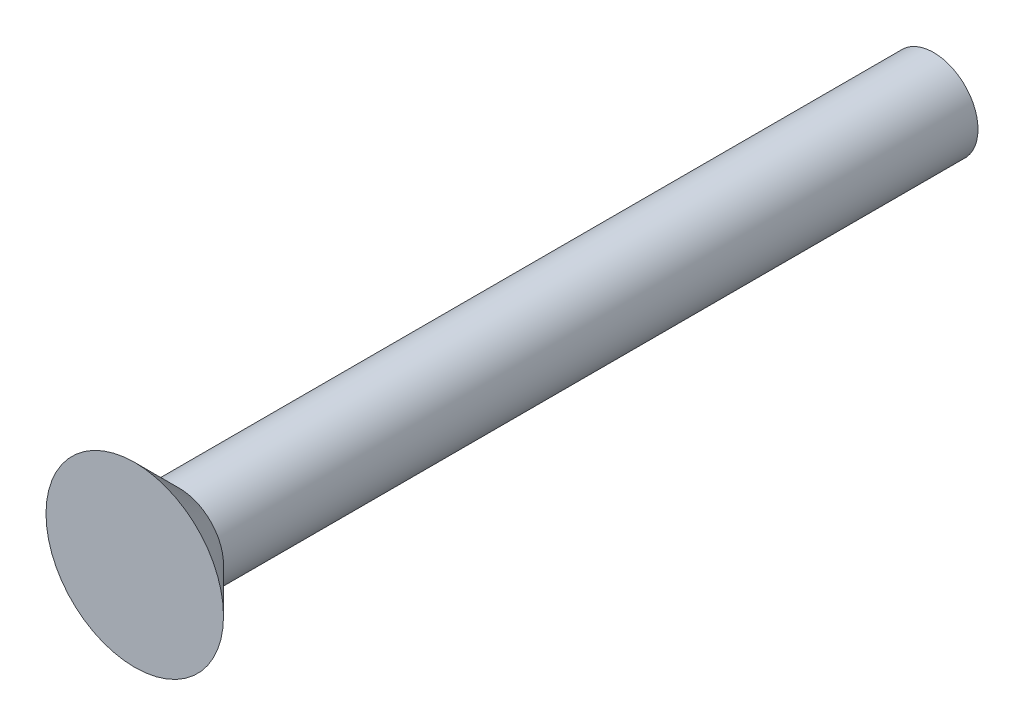
ISO-10303-21;
HEADER;
FILE_DESCRIPTION(('STEP AP214'),'2;1');
FILE_NAME('part.step','',(''),(''),'','','');
FILE_SCHEMA(('AUTOMOTIVE_DESIGN { 1 0 10303 214 1 1 1 1 }'));
ENDSEC;
DATA;
#1=APPLICATION_CONTEXT('core data for automotive mechanical design processes');
#2=APPLICATION_PROTOCOL_DEFINITION('international standard','automotive_design',2000,#1);
#3=PRODUCT_CONTEXT('',#1,'mechanical');
#4=PRODUCT('Part','Part','',(#3));
#5=PRODUCT_RELATED_PRODUCT_CATEGORY('part','',(#4));
#6=PRODUCT_DEFINITION_FORMATION('','',#4);
#7=PRODUCT_DEFINITION_CONTEXT('part definition',#1,'design');
#8=PRODUCT_DEFINITION('design','',#6,#7);
#9=PRODUCT_DEFINITION_SHAPE('','',#8);
#10=(LENGTH_UNIT() NAMED_UNIT(*) SI_UNIT(.MILLI.,.METRE.));
#11=(NAMED_UNIT(*) PLANE_ANGLE_UNIT() SI_UNIT($,.RADIAN.));
#12=(NAMED_UNIT(*) SI_UNIT($,.STERADIAN.) SOLID_ANGLE_UNIT());
#13=UNCERTAINTY_MEASURE_WITH_UNIT(LENGTH_MEASURE(1.E-05),#10,'distance_accuracy_value','');
#14=(GEOMETRIC_REPRESENTATION_CONTEXT(3) GLOBAL_UNCERTAINTY_ASSIGNED_CONTEXT((#13)) GLOBAL_UNIT_ASSIGNED_CONTEXT((#10,
#11,#12)) REPRESENTATION_CONTEXT('',''));
#15=CARTESIAN_POINT('',(0.,0.,0.));
#16=DIRECTION('',(0.,0.,1.));
#17=DIRECTION('',(1.,0.,0.));
#18=AXIS2_PLACEMENT_3D('',#15,#16,#17);
#19=CARTESIAN_POINT('',(0.,0.,0.));
#20=DIRECTION('',(0.,0.,1.));
#21=DIRECTION('',(1.,0.,0.));
#22=AXIS2_PLACEMENT_3D('',#19,#20,#21);
#23=PLANE('',#22);
#24=CARTESIAN_POINT('',(0.,0.,0.));
#25=DIRECTION('',(0.,0.,-1.));
#26=DIRECTION('',(-1.,0.,0.));
#27=AXIS2_PLACEMENT_3D('',#24,#25,#26);
#28=CIRCLE('',#27,2.);
#29=CARTESIAN_POINT('',(-2.,0.,0.));
#30=VERTEX_POINT('',#29);
#31=EDGE_CURVE('E10',#30,#30,#28,.T.);
#32=ORIENTED_EDGE('',*,*,#31,.F.);
#33=EDGE_LOOP('',(#32));
#34=FACE_BOUND('',#33,.T.);
#35=ADVANCED_FACE('F40',(#34),#23,.T.);
#36=CARTESIAN_POINT('',(0.,0.,-1.));
#37=DIRECTION('',(0.,0.,1.));
#38=DIRECTION('',(1.,0.,0.));
#39=AXIS2_PLACEMENT_3D('',#36,#37,#38);
#40=CONICAL_SURFACE('',#39,1.,0.785398163397448);
#41=ORIENTED_EDGE('',*,*,#31,.T.);
#42=EDGE_LOOP('',(#41));
#43=FACE_BOUND('',#42,.T.);
#44=CARTESIAN_POINT('',(0.,0.,-1.));
#45=DIRECTION('',(0.,0.,1.));
#46=DIRECTION('',(1.,0.,0.));
#47=AXIS2_PLACEMENT_3D('',#44,#45,#46);
#48=CIRCLE('',#47,1.);
#49=CARTESIAN_POINT('',(1.,0.,-1.));
#50=VERTEX_POINT('',#49);
#51=EDGE_CURVE('E50',#50,#50,#48,.T.);
#52=ORIENTED_EDGE('',*,*,#51,.T.);
#53=EDGE_LOOP('',(#52));
#54=FACE_BOUND('',#53,.T.);
#55=ADVANCED_FACE('F39',(#43,#54),#40,.T.);
#56=CARTESIAN_POINT('',(0.,0.,-0.998999999999996));
#57=DIRECTION('',(0.,0.,-1.));
#58=DIRECTION('',(-1.,0.,0.));
#59=AXIS2_PLACEMENT_3D('',#56,#57,#58);
#60=CYLINDRICAL_SURFACE('',#59,1.);
#61=ORIENTED_EDGE('',*,*,#51,.F.);
#62=EDGE_LOOP('',(#61));
#63=FACE_BOUND('',#62,.T.);
#64=CARTESIAN_POINT('',(0.,0.,-18.));
#65=DIRECTION('',(0.,0.,1.));
#66=DIRECTION('',(1.,0.,0.));
#67=AXIS2_PLACEMENT_3D('',#64,#65,#66);
#68=CIRCLE('',#67,1.);
#69=CARTESIAN_POINT('',(1.,0.,-18.));
#70=VERTEX_POINT('',#69);
#71=EDGE_CURVE('E55',#70,#70,#68,.T.);
#72=ORIENTED_EDGE('',*,*,#71,.T.);
#73=EDGE_LOOP('',(#72));
#74=FACE_BOUND('',#73,.T.);
#75=ADVANCED_FACE('F64',(#63,#74),#60,.T.);
#76=CARTESIAN_POINT('',(0.,0.,-18.));
#77=DIRECTION('',(0.,0.,1.));
#78=DIRECTION('',(1.,0.,0.));
#79=AXIS2_PLACEMENT_3D('',#76,#77,#78);
#80=PLANE('',#79);
#81=ORIENTED_EDGE('',*,*,#71,.F.);
#82=EDGE_LOOP('',(#81));
#83=FACE_BOUND('',#82,.T.);
#84=ADVANCED_FACE('F70',(#83),#80,.F.);
#85=CLOSED_SHELL('',(#35,#55,#75,#84));
#86=MANIFOLD_SOLID_BREP('B2',#85);
#87=ADVANCED_BREP_SHAPE_REPRESENTATION('',(#18,#86),#14);
#88=SHAPE_DEFINITION_REPRESENTATION(#9,#87);
ENDSEC;
END-ISO-10303-21;
